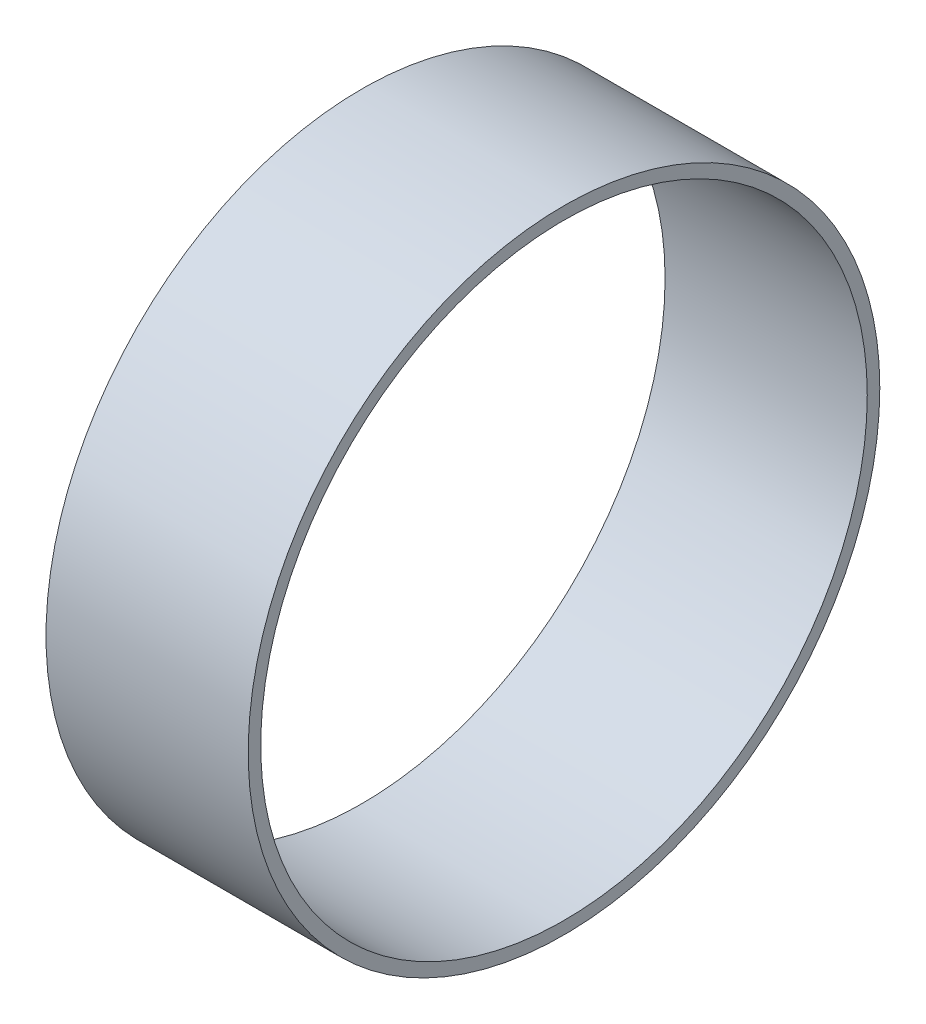
ISO-10303-21;
HEADER;
FILE_DESCRIPTION(('STEP AP214'),'2;1');
FILE_NAME('part.step','',(''),(''),'','','');
FILE_SCHEMA(('AUTOMOTIVE_DESIGN { 1 0 10303 214 1 1 1 1 }'));
ENDSEC;
DATA;
#1=APPLICATION_CONTEXT('core data for automotive mechanical design processes');
#2=APPLICATION_PROTOCOL_DEFINITION('international standard','automotive_design',2000,#1);
#3=PRODUCT_CONTEXT('',#1,'mechanical');
#4=PRODUCT('Part','Part','',(#3));
#5=PRODUCT_RELATED_PRODUCT_CATEGORY('part','',(#4));
#6=PRODUCT_DEFINITION_FORMATION('','',#4);
#7=PRODUCT_DEFINITION_CONTEXT('part definition',#1,'design');
#8=PRODUCT_DEFINITION('design','',#6,#7);
#9=PRODUCT_DEFINITION_SHAPE('','',#8);
#10=(LENGTH_UNIT() NAMED_UNIT(*) SI_UNIT(.MILLI.,.METRE.));
#11=(NAMED_UNIT(*) PLANE_ANGLE_UNIT() SI_UNIT($,.RADIAN.));
#12=(NAMED_UNIT(*) SI_UNIT($,.STERADIAN.) SOLID_ANGLE_UNIT());
#13=UNCERTAINTY_MEASURE_WITH_UNIT(LENGTH_MEASURE(1.E-05),#10,'distance_accuracy_value','');
#14=(GEOMETRIC_REPRESENTATION_CONTEXT(3) GLOBAL_UNCERTAINTY_ASSIGNED_CONTEXT((#13)) GLOBAL_UNIT_ASSIGNED_CONTEXT((#10,
#11,#12)) REPRESENTATION_CONTEXT('',''));
#15=CARTESIAN_POINT('',(0.,0.,0.));
#16=DIRECTION('',(0.,0.,1.));
#17=DIRECTION('',(1.,0.,0.));
#18=AXIS2_PLACEMENT_3D('',#15,#16,#17);
#19=CARTESIAN_POINT('',(25.4,0.,0.));
#20=DIRECTION('',(1.,0.,0.));
#21=DIRECTION('',(0.,0.,-1.));
#22=AXIS2_PLACEMENT_3D('',#19,#20,#21);
#23=PLANE('',#22);
#24=CARTESIAN_POINT('',(25.4,0.,0.));
#25=DIRECTION('',(1.,0.,0.));
#26=DIRECTION('',(0.,0.,-1.));
#27=AXIS2_PLACEMENT_3D('',#24,#25,#26);
#28=CIRCLE('',#27,39.6748);
#29=CARTESIAN_POINT('',(25.4,0.,-39.6748));
#30=VERTEX_POINT('',#29);
#31=EDGE_CURVE('E10',#30,#30,#28,.T.);
#32=ORIENTED_EDGE('',*,*,#31,.T.);
#33=EDGE_LOOP('',(#32));
#34=FACE_BOUND('',#33,.T.);
#35=CARTESIAN_POINT('',(25.4,0.,0.));
#36=DIRECTION('',(1.,0.,0.));
#37=DIRECTION('',(0.,0.,-1.));
#38=AXIS2_PLACEMENT_3D('',#35,#36,#37);
#39=CIRCLE('',#38,38.1);
#40=CARTESIAN_POINT('',(25.4,0.,-38.1));
#41=VERTEX_POINT('',#40);
#42=EDGE_CURVE('E54',#41,#41,#39,.T.);
#43=ORIENTED_EDGE('',*,*,#42,.F.);
#44=EDGE_LOOP('',(#43));
#45=FACE_BOUND('',#44,.T.);
#46=ADVANCED_FACE('F41',(#34,#45),#23,.T.);
#47=CARTESIAN_POINT('',(0.,0.,0.));
#48=DIRECTION('',(1.,0.,0.));
#49=DIRECTION('',(0.,0.,-1.));
#50=AXIS2_PLACEMENT_3D('',#47,#48,#49);
#51=PLANE('',#50);
#52=CARTESIAN_POINT('',(0.,0.,0.));
#53=DIRECTION('',(1.,0.,0.));
#54=DIRECTION('',(0.,0.,-1.));
#55=AXIS2_PLACEMENT_3D('',#52,#53,#54);
#56=CIRCLE('',#55,39.6748);
#57=CARTESIAN_POINT('',(0.,0.,-39.6748));
#58=VERTEX_POINT('',#57);
#59=EDGE_CURVE('E45',#58,#58,#56,.T.);
#60=ORIENTED_EDGE('',*,*,#59,.F.);
#61=EDGE_LOOP('',(#60));
#62=FACE_BOUND('',#61,.T.);
#63=CARTESIAN_POINT('',(0.,0.,0.));
#64=DIRECTION('',(1.,0.,0.));
#65=DIRECTION('',(0.,0.,-1.));
#66=AXIS2_PLACEMENT_3D('',#63,#64,#65);
#67=CIRCLE('',#66,38.1);
#68=CARTESIAN_POINT('',(0.,0.,-38.1));
#69=VERTEX_POINT('',#68);
#70=EDGE_CURVE('E56',#69,#69,#67,.T.);
#71=ORIENTED_EDGE('',*,*,#70,.T.);
#72=EDGE_LOOP('',(#71));
#73=FACE_BOUND('',#72,.T.);
#74=ADVANCED_FACE('F68',(#62,#73),#51,.F.);
#75=CARTESIAN_POINT('',(25.4,0.,0.));
#76=DIRECTION('',(-1.,0.,0.));
#77=DIRECTION('',(0.,0.,1.));
#78=AXIS2_PLACEMENT_3D('',#75,#76,#77);
#79=CYLINDRICAL_SURFACE('',#78,39.6748);
#80=ORIENTED_EDGE('',*,*,#31,.F.);
#81=EDGE_LOOP('',(#80));
#82=FACE_BOUND('',#81,.T.);
#83=ORIENTED_EDGE('',*,*,#59,.T.);
#84=EDGE_LOOP('',(#83));
#85=FACE_BOUND('',#84,.T.);
#86=ADVANCED_FACE('F43',(#82,#85),#79,.T.);
#87=CARTESIAN_POINT('',(25.4,0.,0.));
#88=DIRECTION('',(-1.,0.,0.));
#89=DIRECTION('',(0.,0.,1.));
#90=AXIS2_PLACEMENT_3D('',#87,#88,#89);
#91=CYLINDRICAL_SURFACE('',#90,38.1);
#92=ORIENTED_EDGE('',*,*,#42,.T.);
#93=EDGE_LOOP('',(#92));
#94=FACE_BOUND('',#93,.T.);
#95=ORIENTED_EDGE('',*,*,#70,.F.);
#96=EDGE_LOOP('',(#95));
#97=FACE_BOUND('',#96,.T.);
#98=ADVANCED_FACE('F64',(#94,#97),#91,.F.);
#99=CLOSED_SHELL('',(#46,#74,#86,#98));
#100=MANIFOLD_SOLID_BREP('B2',#99);
#101=ADVANCED_BREP_SHAPE_REPRESENTATION('',(#18,#100),#14);
#102=SHAPE_DEFINITION_REPRESENTATION(#9,#101);
ENDSEC;
END-ISO-10303-21;
